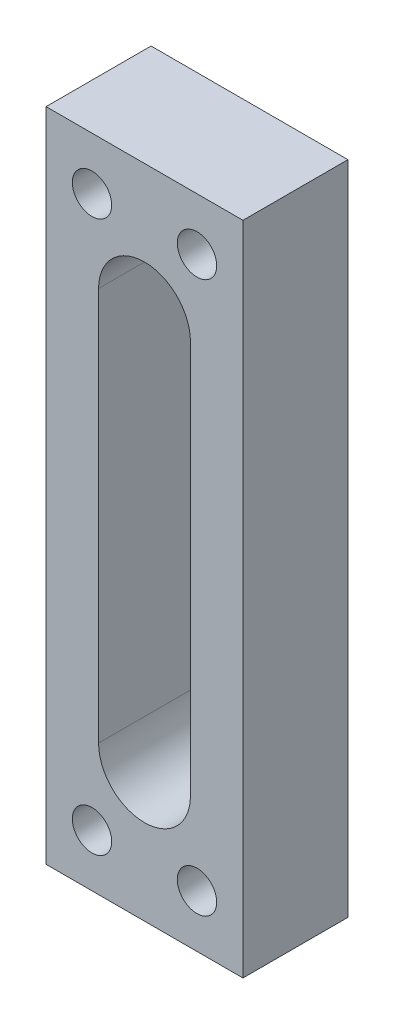
ISO-10303-21;
HEADER;
FILE_DESCRIPTION(('STEP AP214'),'2;1');
FILE_NAME('part.step','',(''),(''),'','','');
FILE_SCHEMA(('AUTOMOTIVE_DESIGN { 1 0 10303 214 1 1 1 1 }'));
ENDSEC;
DATA;
#1=APPLICATION_CONTEXT('core data for automotive mechanical design processes');
#2=APPLICATION_PROTOCOL_DEFINITION('international standard','automotive_design',2000,#1);
#3=PRODUCT_CONTEXT('',#1,'mechanical');
#4=PRODUCT('Part','Part','',(#3));
#5=PRODUCT_RELATED_PRODUCT_CATEGORY('part','',(#4));
#6=PRODUCT_DEFINITION_FORMATION('','',#4);
#7=PRODUCT_DEFINITION_CONTEXT('part definition',#1,'design');
#8=PRODUCT_DEFINITION('design','',#6,#7);
#9=PRODUCT_DEFINITION_SHAPE('','',#8);
#10=(LENGTH_UNIT() NAMED_UNIT(*) SI_UNIT(.MILLI.,.METRE.));
#11=(NAMED_UNIT(*) PLANE_ANGLE_UNIT() SI_UNIT($,.RADIAN.));
#12=(NAMED_UNIT(*) SI_UNIT($,.STERADIAN.) SOLID_ANGLE_UNIT());
#13=UNCERTAINTY_MEASURE_WITH_UNIT(LENGTH_MEASURE(1.E-05),#10,'distance_accuracy_value','');
#14=(GEOMETRIC_REPRESENTATION_CONTEXT(3) GLOBAL_UNCERTAINTY_ASSIGNED_CONTEXT((#13)) GLOBAL_UNIT_ASSIGNED_CONTEXT((#10,
#11,#12)) REPRESENTATION_CONTEXT('',''));
#15=CARTESIAN_POINT('',(0.,0.,0.));
#16=DIRECTION('',(0.,0.,1.));
#17=DIRECTION('',(1.,0.,0.));
#18=AXIS2_PLACEMENT_3D('',#15,#16,#17);
#19=CARTESIAN_POINT('',(7.49999999999999,25.,8.));
#20=DIRECTION('',(-1.,0.,0.));
#21=DIRECTION('',(0.,-1.,0.));
#22=AXIS2_PLACEMENT_3D('',#19,#20,#21);
#23=PLANE('',#22);
#24=DIRECTION('',(0.,1.,0.));
#25=VECTOR('',#24,1.);
#26=CARTESIAN_POINT('',(7.49999999999999,25.,0.));
#27=LINE('',#26,#25);
#28=CARTESIAN_POINT('',(7.5,-25.,0.));
#29=VERTEX_POINT('',#28);
#30=CARTESIAN_POINT('',(7.49999999999999,25.,0.));
#31=VERTEX_POINT('',#30);
#32=EDGE_CURVE('E181',#29,#31,#27,.T.);
#33=ORIENTED_EDGE('',*,*,#32,.T.);
#34=DIRECTION('',(0.,0.,-1.));
#35=VECTOR('',#34,1.);
#36=CARTESIAN_POINT('',(7.49999999999999,25.,8.));
#37=LINE('',#36,#35);
#38=CARTESIAN_POINT('',(7.49999999999999,25.,8.));
#39=VERTEX_POINT('',#38);
#40=EDGE_CURVE('E11',#39,#31,#37,.T.);
#41=ORIENTED_EDGE('',*,*,#40,.F.);
#42=DIRECTION('',(0.,1.,0.));
#43=VECTOR('',#42,1.);
#44=CARTESIAN_POINT('',(7.49999999999999,25.,8.));
#45=LINE('',#44,#43);
#46=CARTESIAN_POINT('',(7.5,-25.,8.));
#47=VERTEX_POINT('',#46);
#48=EDGE_CURVE('E185',#47,#39,#45,.T.);
#49=ORIENTED_EDGE('',*,*,#48,.F.);
#50=DIRECTION('',(0.,0.,-1.));
#51=VECTOR('',#50,1.);
#52=CARTESIAN_POINT('',(7.5,-25.,8.));
#53=LINE('',#52,#51);
#54=EDGE_CURVE('E199',#47,#29,#53,.T.);
#55=ORIENTED_EDGE('',*,*,#54,.T.);
#56=EDGE_LOOP('',(#33,#41,#49,#55));
#57=FACE_BOUND('',#56,.T.);
#58=ADVANCED_FACE('F39',(#57),#23,.F.);
#59=CARTESIAN_POINT('',(-7.5,25.,8.));
#60=DIRECTION('',(0.,-1.,0.));
#61=DIRECTION('',(0.,0.,-1.));
#62=AXIS2_PLACEMENT_3D('',#59,#60,#61);
#63=PLANE('',#62);
#64=DIRECTION('',(-1.,0.,0.));
#65=VECTOR('',#64,1.);
#66=CARTESIAN_POINT('',(-7.5,25.,0.));
#67=LINE('',#66,#65);
#68=CARTESIAN_POINT('',(-7.5,25.,0.));
#69=VERTEX_POINT('',#68);
#70=EDGE_CURVE('E203',#31,#69,#67,.T.);
#71=ORIENTED_EDGE('',*,*,#70,.T.);
#72=DIRECTION('',(0.,0.,-1.));
#73=VECTOR('',#72,1.);
#74=CARTESIAN_POINT('',(-7.5,25.,8.));
#75=LINE('',#74,#73);
#76=CARTESIAN_POINT('',(-7.5,25.,8.));
#77=VERTEX_POINT('',#76);
#78=EDGE_CURVE('E47',#77,#69,#75,.T.);
#79=ORIENTED_EDGE('',*,*,#78,.F.);
#80=DIRECTION('',(-1.,0.,0.));
#81=VECTOR('',#80,1.);
#82=CARTESIAN_POINT('',(-7.5,25.,8.));
#83=LINE('',#82,#81);
#84=EDGE_CURVE('E189',#39,#77,#83,.T.);
#85=ORIENTED_EDGE('',*,*,#84,.F.);
#86=ORIENTED_EDGE('',*,*,#40,.T.);
#87=EDGE_LOOP('',(#71,#79,#85,#86));
#88=FACE_BOUND('',#87,.T.);
#89=ADVANCED_FACE('F238',(#88),#63,.F.);
#90=CARTESIAN_POINT('',(-7.5,25.,8.));
#91=DIRECTION('',(1.,0.,0.));
#92=DIRECTION('',(0.,1.,0.));
#93=AXIS2_PLACEMENT_3D('',#90,#91,#92);
#94=PLANE('',#93);
#95=DIRECTION('',(0.,-1.,0.));
#96=VECTOR('',#95,1.);
#97=CARTESIAN_POINT('',(-7.5,25.,0.));
#98=LINE('',#97,#96);
#99=CARTESIAN_POINT('',(-7.5,-25.,0.));
#100=VERTEX_POINT('',#99);
#101=EDGE_CURVE('E206',#69,#100,#98,.T.);
#102=ORIENTED_EDGE('',*,*,#101,.T.);
#103=DIRECTION('',(0.,0.,-1.));
#104=VECTOR('',#103,1.);
#105=CARTESIAN_POINT('',(-7.5,-25.,8.));
#106=LINE('',#105,#104);
#107=CARTESIAN_POINT('',(-7.5,-25.,8.));
#108=VERTEX_POINT('',#107);
#109=EDGE_CURVE('E214',#108,#100,#106,.T.);
#110=ORIENTED_EDGE('',*,*,#109,.F.);
#111=DIRECTION('',(0.,-1.,0.));
#112=VECTOR('',#111,1.);
#113=CARTESIAN_POINT('',(-7.5,25.,8.));
#114=LINE('',#113,#112);
#115=EDGE_CURVE('E193',#77,#108,#114,.T.);
#116=ORIENTED_EDGE('',*,*,#115,.F.);
#117=ORIENTED_EDGE('',*,*,#78,.T.);
#118=EDGE_LOOP('',(#102,#110,#116,#117));
#119=FACE_BOUND('',#118,.T.);
#120=ADVANCED_FACE('F223',(#119),#94,.F.);
#121=CARTESIAN_POINT('',(-7.5,-25.,8.));
#122=DIRECTION('',(0.,1.,0.));
#123=DIRECTION('',(0.,0.,1.));
#124=AXIS2_PLACEMENT_3D('',#121,#122,#123);
#125=PLANE('',#124);
#126=DIRECTION('',(1.,0.,0.));
#127=VECTOR('',#126,1.);
#128=CARTESIAN_POINT('',(-7.5,-25.,0.));
#129=LINE('',#128,#127);
#130=EDGE_CURVE('E190',#100,#29,#129,.T.);
#131=ORIENTED_EDGE('',*,*,#130,.T.);
#132=ORIENTED_EDGE('',*,*,#54,.F.);
#133=DIRECTION('',(1.,0.,0.));
#134=VECTOR('',#133,1.);
#135=CARTESIAN_POINT('',(-7.5,-25.,8.));
#136=LINE('',#135,#134);
#137=EDGE_CURVE('E196',#108,#47,#136,.T.);
#138=ORIENTED_EDGE('',*,*,#137,.F.);
#139=ORIENTED_EDGE('',*,*,#109,.T.);
#140=EDGE_LOOP('',(#131,#132,#138,#139));
#141=FACE_BOUND('',#140,.T.);
#142=ADVANCED_FACE('F231',(#141),#125,.F.);
#143=CARTESIAN_POINT('',(0.,0.,8.));
#144=DIRECTION('',(0.,0.,1.));
#145=DIRECTION('',(1.,0.,0.));
#146=AXIS2_PLACEMENT_3D('',#143,#144,#145);
#147=PLANE('',#146);
#148=CARTESIAN_POINT('',(0.,15.,8.));
#149=DIRECTION('',(0.,0.,1.));
#150=DIRECTION('',(1.,0.,0.));
#151=AXIS2_PLACEMENT_3D('',#148,#149,#150);
#152=CIRCLE('',#151,3.5);
#153=CARTESIAN_POINT('',(3.5,15.,8.));
#154=VERTEX_POINT('',#153);
#155=CARTESIAN_POINT('',(-3.50000000000001,15.,8.));
#156=VERTEX_POINT('',#155);
#157=EDGE_CURVE('E54',#154,#156,#152,.T.);
#158=ORIENTED_EDGE('',*,*,#157,.F.);
#159=DIRECTION('',(0.,1.,0.));
#160=VECTOR('',#159,1.);
#161=CARTESIAN_POINT('',(3.5,15.,8.));
#162=LINE('',#161,#160);
#163=CARTESIAN_POINT('',(3.50000000000001,-15.,8.));
#164=VERTEX_POINT('',#163);
#165=EDGE_CURVE('E125',#164,#154,#162,.T.);
#166=ORIENTED_EDGE('',*,*,#165,.F.);
#167=CARTESIAN_POINT('',(0.,-15.,8.));
#168=DIRECTION('',(0.,0.,1.));
#169=DIRECTION('',(1.,0.,0.));
#170=AXIS2_PLACEMENT_3D('',#167,#168,#169);
#171=CIRCLE('',#170,3.5);
#172=CARTESIAN_POINT('',(-3.5,-15.,8.));
#173=VERTEX_POINT('',#172);
#174=EDGE_CURVE('E129',#173,#164,#171,.T.);
#175=ORIENTED_EDGE('',*,*,#174,.F.);
#176=DIRECTION('',(0.,-1.,0.));
#177=VECTOR('',#176,1.);
#178=CARTESIAN_POINT('',(-3.5,15.,8.));
#179=LINE('',#178,#177);
#180=EDGE_CURVE('E138',#156,#173,#179,.T.);
#181=ORIENTED_EDGE('',*,*,#180,.F.);
#182=EDGE_LOOP('',(#158,#166,#175,#181));
#183=FACE_BOUND('',#182,.T.);
#184=CARTESIAN_POINT('',(-4.,-21.,8.));
#185=DIRECTION('',(0.,0.,1.));
#186=DIRECTION('',(1.,0.,0.));
#187=AXIS2_PLACEMENT_3D('',#184,#185,#186);
#188=CIRCLE('',#187,1.5);
#189=CARTESIAN_POINT('',(-2.5,-21.,8.));
#190=VERTEX_POINT('',#189);
#191=EDGE_CURVE('E147',#190,#190,#188,.T.);
#192=ORIENTED_EDGE('',*,*,#191,.F.);
#193=EDGE_LOOP('',(#192));
#194=FACE_BOUND('',#193,.T.);
#195=CARTESIAN_POINT('',(4.,-21.,8.));
#196=DIRECTION('',(0.,0.,1.));
#197=DIRECTION('',(1.,0.,0.));
#198=AXIS2_PLACEMENT_3D('',#195,#196,#197);
#199=CIRCLE('',#198,1.5);
#200=CARTESIAN_POINT('',(5.5,-21.,8.));
#201=VERTEX_POINT('',#200);
#202=EDGE_CURVE('E166',#201,#201,#199,.T.);
#203=ORIENTED_EDGE('',*,*,#202,.F.);
#204=EDGE_LOOP('',(#203));
#205=FACE_BOUND('',#204,.T.);
#206=CARTESIAN_POINT('',(4.,21.,8.));
#207=DIRECTION('',(0.,0.,1.));
#208=DIRECTION('',(1.,0.,0.));
#209=AXIS2_PLACEMENT_3D('',#206,#207,#208);
#210=CIRCLE('',#209,1.5);
#211=CARTESIAN_POINT('',(5.5,21.,8.));
#212=VERTEX_POINT('',#211);
#213=EDGE_CURVE('E158',#212,#212,#210,.T.);
#214=ORIENTED_EDGE('',*,*,#213,.F.);
#215=EDGE_LOOP('',(#214));
#216=FACE_BOUND('',#215,.T.);
#217=CARTESIAN_POINT('',(-4.,21.,8.));
#218=DIRECTION('',(0.,0.,1.));
#219=DIRECTION('',(1.,0.,0.));
#220=AXIS2_PLACEMENT_3D('',#217,#218,#219);
#221=CIRCLE('',#220,1.5);
#222=CARTESIAN_POINT('',(-2.5,21.,8.));
#223=VERTEX_POINT('',#222);
#224=EDGE_CURVE('E157',#223,#223,#221,.T.);
#225=ORIENTED_EDGE('',*,*,#224,.F.);
#226=EDGE_LOOP('',(#225));
#227=FACE_BOUND('',#226,.T.);
#228=ORIENTED_EDGE('',*,*,#48,.T.);
#229=ORIENTED_EDGE('',*,*,#84,.T.);
#230=ORIENTED_EDGE('',*,*,#115,.T.);
#231=ORIENTED_EDGE('',*,*,#137,.T.);
#232=EDGE_LOOP('',(#228,#229,#230,#231));
#233=FACE_BOUND('',#232,.T.);
#234=ADVANCED_FACE('F237',(#183,#194,#205,#216,#227,#233),#147,.T.);
#235=CARTESIAN_POINT('',(0.,0.,0.));
#236=DIRECTION('',(0.,0.,1.));
#237=DIRECTION('',(1.,0.,0.));
#238=AXIS2_PLACEMENT_3D('',#235,#236,#237);
#239=PLANE('',#238);
#240=DIRECTION('',(0.,1.,0.));
#241=VECTOR('',#240,1.);
#242=CARTESIAN_POINT('',(3.5,15.,0.));
#243=LINE('',#242,#241);
#244=CARTESIAN_POINT('',(3.50000000000001,-15.,0.));
#245=VERTEX_POINT('',#244);
#246=CARTESIAN_POINT('',(3.5,15.,0.));
#247=VERTEX_POINT('',#246);
#248=EDGE_CURVE('E113',#245,#247,#243,.T.);
#249=ORIENTED_EDGE('',*,*,#248,.T.);
#250=CARTESIAN_POINT('',(0.,15.,0.));
#251=DIRECTION('',(0.,0.,1.));
#252=DIRECTION('',(1.,0.,0.));
#253=AXIS2_PLACEMENT_3D('',#250,#251,#252);
#254=CIRCLE('',#253,3.5);
#255=CARTESIAN_POINT('',(-3.5,15.,0.));
#256=VERTEX_POINT('',#255);
#257=EDGE_CURVE('E106',#247,#256,#254,.T.);
#258=ORIENTED_EDGE('',*,*,#257,.T.);
#259=DIRECTION('',(0.,-1.,0.));
#260=VECTOR('',#259,1.);
#261=CARTESIAN_POINT('',(-3.5,15.,0.));
#262=LINE('',#261,#260);
#263=CARTESIAN_POINT('',(-3.5,-15.,0.));
#264=VERTEX_POINT('',#263);
#265=EDGE_CURVE('E116',#256,#264,#262,.T.);
#266=ORIENTED_EDGE('',*,*,#265,.T.);
#267=CARTESIAN_POINT('',(0.,-15.,0.));
#268=DIRECTION('',(0.,0.,1.));
#269=DIRECTION('',(1.,0.,0.));
#270=AXIS2_PLACEMENT_3D('',#267,#268,#269);
#271=CIRCLE('',#270,3.5);
#272=EDGE_CURVE('E62',#264,#245,#271,.T.);
#273=ORIENTED_EDGE('',*,*,#272,.T.);
#274=EDGE_LOOP('',(#249,#258,#266,#273));
#275=FACE_BOUND('',#274,.T.);
#276=CARTESIAN_POINT('',(-4.,-21.,0.));
#277=DIRECTION('',(0.,0.,1.));
#278=DIRECTION('',(1.,0.,0.));
#279=AXIS2_PLACEMENT_3D('',#276,#277,#278);
#280=CIRCLE('',#279,1.5);
#281=CARTESIAN_POINT('',(-2.5,-21.,0.));
#282=VERTEX_POINT('',#281);
#283=EDGE_CURVE('E170',#282,#282,#280,.T.);
#284=ORIENTED_EDGE('',*,*,#283,.T.);
#285=EDGE_LOOP('',(#284));
#286=FACE_BOUND('',#285,.T.);
#287=CARTESIAN_POINT('',(4.,-21.,0.));
#288=DIRECTION('',(0.,0.,1.));
#289=DIRECTION('',(1.,0.,0.));
#290=AXIS2_PLACEMENT_3D('',#287,#288,#289);
#291=CIRCLE('',#290,1.5);
#292=CARTESIAN_POINT('',(5.5,-21.,0.));
#293=VERTEX_POINT('',#292);
#294=EDGE_CURVE('E162',#293,#293,#291,.T.);
#295=ORIENTED_EDGE('',*,*,#294,.T.);
#296=EDGE_LOOP('',(#295));
#297=FACE_BOUND('',#296,.T.);
#298=CARTESIAN_POINT('',(4.,21.,0.));
#299=DIRECTION('',(0.,0.,1.));
#300=DIRECTION('',(1.,0.,0.));
#301=AXIS2_PLACEMENT_3D('',#298,#299,#300);
#302=CIRCLE('',#301,1.5);
#303=CARTESIAN_POINT('',(5.5,21.,0.));
#304=VERTEX_POINT('',#303);
#305=EDGE_CURVE('E153',#304,#304,#302,.T.);
#306=ORIENTED_EDGE('',*,*,#305,.T.);
#307=EDGE_LOOP('',(#306));
#308=FACE_BOUND('',#307,.T.);
#309=CARTESIAN_POINT('',(-4.,21.,0.));
#310=DIRECTION('',(0.,0.,1.));
#311=DIRECTION('',(1.,0.,0.));
#312=AXIS2_PLACEMENT_3D('',#309,#310,#311);
#313=CIRCLE('',#312,1.5);
#314=CARTESIAN_POINT('',(-2.5,21.,0.));
#315=VERTEX_POINT('',#314);
#316=EDGE_CURVE('E177',#315,#315,#313,.T.);
#317=ORIENTED_EDGE('',*,*,#316,.T.);
#318=EDGE_LOOP('',(#317));
#319=FACE_BOUND('',#318,.T.);
#320=ORIENTED_EDGE('',*,*,#32,.F.);
#321=ORIENTED_EDGE('',*,*,#130,.F.);
#322=ORIENTED_EDGE('',*,*,#101,.F.);
#323=ORIENTED_EDGE('',*,*,#70,.F.);
#324=EDGE_LOOP('',(#320,#321,#322,#323));
#325=FACE_BOUND('',#324,.T.);
#326=ADVANCED_FACE('F121',(#275,#286,#297,#308,#319,#325),#239,.F.);
#327=CARTESIAN_POINT('',(-4.,21.,0.));
#328=DIRECTION('',(0.,0.,1.));
#329=DIRECTION('',(1.,0.,0.));
#330=AXIS2_PLACEMENT_3D('',#327,#328,#329);
#331=CYLINDRICAL_SURFACE('',#330,1.5);
#332=ORIENTED_EDGE('',*,*,#316,.F.);
#333=EDGE_LOOP('',(#332));
#334=FACE_BOUND('',#333,.T.);
#335=ORIENTED_EDGE('',*,*,#224,.T.);
#336=EDGE_LOOP('',(#335));
#337=FACE_BOUND('',#336,.T.);
#338=ADVANCED_FACE('F250',(#334,#337),#331,.F.);
#339=CARTESIAN_POINT('',(4.,21.,0.));
#340=DIRECTION('',(0.,0.,1.));
#341=DIRECTION('',(1.,0.,0.));
#342=AXIS2_PLACEMENT_3D('',#339,#340,#341);
#343=CYLINDRICAL_SURFACE('',#342,1.5);
#344=ORIENTED_EDGE('',*,*,#305,.F.);
#345=EDGE_LOOP('',(#344));
#346=FACE_BOUND('',#345,.T.);
#347=ORIENTED_EDGE('',*,*,#213,.T.);
#348=EDGE_LOOP('',(#347));
#349=FACE_BOUND('',#348,.T.);
#350=ADVANCED_FACE('F256',(#346,#349),#343,.F.);
#351=CARTESIAN_POINT('',(4.,-21.,0.));
#352=DIRECTION('',(0.,0.,1.));
#353=DIRECTION('',(1.,0.,0.));
#354=AXIS2_PLACEMENT_3D('',#351,#352,#353);
#355=CYLINDRICAL_SURFACE('',#354,1.5);
#356=ORIENTED_EDGE('',*,*,#294,.F.);
#357=EDGE_LOOP('',(#356));
#358=FACE_BOUND('',#357,.T.);
#359=ORIENTED_EDGE('',*,*,#202,.T.);
#360=EDGE_LOOP('',(#359));
#361=FACE_BOUND('',#360,.T.);
#362=ADVANCED_FACE('F261',(#358,#361),#355,.F.);
#363=CARTESIAN_POINT('',(-4.,-21.,0.));
#364=DIRECTION('',(0.,0.,1.));
#365=DIRECTION('',(1.,0.,0.));
#366=AXIS2_PLACEMENT_3D('',#363,#364,#365);
#367=CYLINDRICAL_SURFACE('',#366,1.5);
#368=ORIENTED_EDGE('',*,*,#283,.F.);
#369=EDGE_LOOP('',(#368));
#370=FACE_BOUND('',#369,.T.);
#371=ORIENTED_EDGE('',*,*,#191,.T.);
#372=EDGE_LOOP('',(#371));
#373=FACE_BOUND('',#372,.T.);
#374=ADVANCED_FACE('F258',(#370,#373),#367,.F.);
#375=CARTESIAN_POINT('',(0.,15.,0.));
#376=DIRECTION('',(0.,0.,1.));
#377=DIRECTION('',(1.,0.,0.));
#378=AXIS2_PLACEMENT_3D('',#375,#376,#377);
#379=CYLINDRICAL_SURFACE('',#378,3.5);
#380=ORIENTED_EDGE('',*,*,#157,.T.);
#381=DIRECTION('',(0.,0.,1.));
#382=VECTOR('',#381,1.);
#383=CARTESIAN_POINT('',(-3.5,15.,0.));
#384=LINE('',#383,#382);
#385=EDGE_CURVE('E102',#256,#156,#384,.T.);
#386=ORIENTED_EDGE('',*,*,#385,.F.);
#387=ORIENTED_EDGE('',*,*,#257,.F.);
#388=DIRECTION('',(0.,0.,1.));
#389=VECTOR('',#388,1.);
#390=CARTESIAN_POINT('',(3.5,15.,0.));
#391=LINE('',#390,#389);
#392=EDGE_CURVE('E144',#247,#154,#391,.T.);
#393=ORIENTED_EDGE('',*,*,#392,.T.);
#394=EDGE_LOOP('',(#380,#386,#387,#393));
#395=FACE_BOUND('',#394,.T.);
#396=ADVANCED_FACE('F104',(#395),#379,.F.);
#397=CARTESIAN_POINT('',(3.5,15.,0.));
#398=DIRECTION('',(1.,0.,0.));
#399=DIRECTION('',(0.,1.,0.));
#400=AXIS2_PLACEMENT_3D('',#397,#398,#399);
#401=PLANE('',#400);
#402=ORIENTED_EDGE('',*,*,#165,.T.);
#403=ORIENTED_EDGE('',*,*,#392,.F.);
#404=ORIENTED_EDGE('',*,*,#248,.F.);
#405=DIRECTION('',(0.,0.,1.));
#406=VECTOR('',#405,1.);
#407=CARTESIAN_POINT('',(3.50000000000001,-15.,0.));
#408=LINE('',#407,#406);
#409=EDGE_CURVE('E148',#245,#164,#408,.T.);
#410=ORIENTED_EDGE('',*,*,#409,.T.);
#411=EDGE_LOOP('',(#402,#403,#404,#410));
#412=FACE_BOUND('',#411,.T.);
#413=ADVANCED_FACE('F271',(#412),#401,.F.);
#414=CARTESIAN_POINT('',(0.,-15.,0.));
#415=DIRECTION('',(0.,0.,1.));
#416=DIRECTION('',(1.,0.,0.));
#417=AXIS2_PLACEMENT_3D('',#414,#415,#416);
#418=CYLINDRICAL_SURFACE('',#417,3.5);
#419=ORIENTED_EDGE('',*,*,#174,.T.);
#420=ORIENTED_EDGE('',*,*,#409,.F.);
#421=ORIENTED_EDGE('',*,*,#272,.F.);
#422=DIRECTION('',(0.,0.,1.));
#423=VECTOR('',#422,1.);
#424=CARTESIAN_POINT('',(-3.5,-15.,0.));
#425=LINE('',#424,#423);
#426=EDGE_CURVE('E112',#264,#173,#425,.T.);
#427=ORIENTED_EDGE('',*,*,#426,.T.);
#428=EDGE_LOOP('',(#419,#420,#421,#427));
#429=FACE_BOUND('',#428,.T.);
#430=ADVANCED_FACE('F274',(#429),#418,.F.);
#431=CARTESIAN_POINT('',(-3.5,15.,0.));
#432=DIRECTION('',(-1.,0.,0.));
#433=DIRECTION('',(0.,-1.,0.));
#434=AXIS2_PLACEMENT_3D('',#431,#432,#433);
#435=PLANE('',#434);
#436=ORIENTED_EDGE('',*,*,#180,.T.);
#437=ORIENTED_EDGE('',*,*,#426,.F.);
#438=ORIENTED_EDGE('',*,*,#265,.F.);
#439=ORIENTED_EDGE('',*,*,#385,.T.);
#440=EDGE_LOOP('',(#436,#437,#438,#439));
#441=FACE_BOUND('',#440,.T.);
#442=ADVANCED_FACE('F117',(#441),#435,.F.);
#443=CLOSED_SHELL('',(#58,#89,#120,#142,#234,#326,#338,#350,#362,#374,#396,#413,#430,#442));
#444=MANIFOLD_SOLID_BREP('B2',#443);
#445=ADVANCED_BREP_SHAPE_REPRESENTATION('',(#18,#444),#14);
#446=SHAPE_DEFINITION_REPRESENTATION(#9,#445);
ENDSEC;
END-ISO-10303-21;
